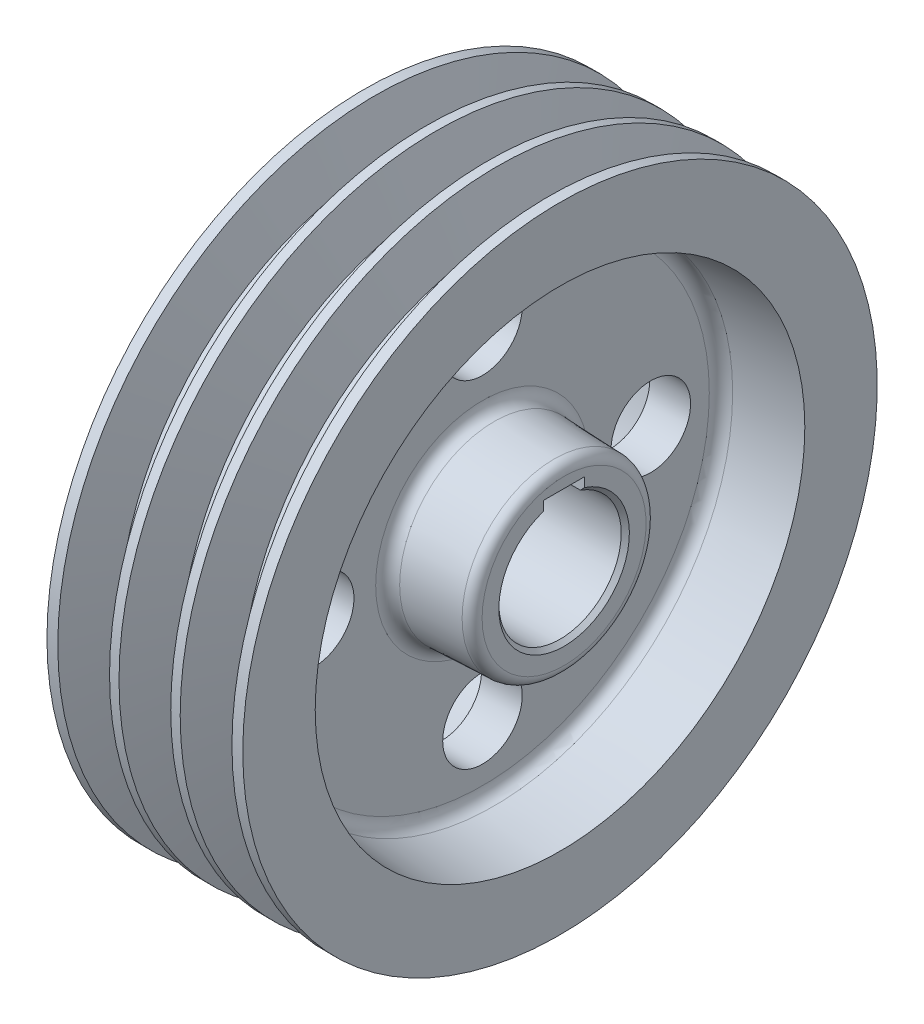
ISO-10303-21;
HEADER;
FILE_DESCRIPTION(('STEP AP214'),'2;1');
FILE_NAME('part.step','',(''),(''),'','','');
FILE_SCHEMA(('AUTOMOTIVE_DESIGN { 1 0 10303 214 1 1 1 1 }'));
ENDSEC;
DATA;
#1=APPLICATION_CONTEXT('core data for automotive mechanical design processes');
#2=APPLICATION_PROTOCOL_DEFINITION('international standard','automotive_design',2000,#1);
#3=PRODUCT_CONTEXT('',#1,'mechanical');
#4=PRODUCT('Part','Part','',(#3));
#5=PRODUCT_RELATED_PRODUCT_CATEGORY('part','',(#4));
#6=PRODUCT_DEFINITION_FORMATION('','',#4);
#7=PRODUCT_DEFINITION_CONTEXT('part definition',#1,'design');
#8=PRODUCT_DEFINITION('design','',#6,#7);
#9=PRODUCT_DEFINITION_SHAPE('','',#8);
#10=(LENGTH_UNIT() NAMED_UNIT(*) SI_UNIT(.MILLI.,.METRE.));
#11=(NAMED_UNIT(*) PLANE_ANGLE_UNIT() SI_UNIT($,.RADIAN.));
#12=(NAMED_UNIT(*) SI_UNIT($,.STERADIAN.) SOLID_ANGLE_UNIT());
#13=UNCERTAINTY_MEASURE_WITH_UNIT(LENGTH_MEASURE(1.E-05),#10,'distance_accuracy_value','');
#14=(GEOMETRIC_REPRESENTATION_CONTEXT(3) GLOBAL_UNCERTAINTY_ASSIGNED_CONTEXT((#13)) GLOBAL_UNIT_ASSIGNED_CONTEXT((#10,
#11,#12)) REPRESENTATION_CONTEXT('',''));
#15=CARTESIAN_POINT('',(0.,0.,0.));
#16=DIRECTION('',(0.,0.,1.));
#17=DIRECTION('',(1.,0.,0.));
#18=AXIS2_PLACEMENT_3D('',#15,#16,#17);
#19=CARTESIAN_POINT('',(19.,24.2497732705182,0.));
#20=DIRECTION('',(1.,0.,0.));
#21=DIRECTION('',(0.,0.,-1.));
#22=AXIS2_PLACEMENT_3D('',#19,#20,#21);
#23=PLANE('',#22);
#24=CARTESIAN_POINT('',(19.,-41.25,2.88047210454558E-13));
#25=DIRECTION('',(1.,0.,0.));
#26=DIRECTION('',(0.,0.,-1.));
#27=AXIS2_PLACEMENT_3D('',#24,#25,#26);
#28=CIRCLE('',#27,9.75000000000001);
#29=CARTESIAN_POINT('',(19.,-41.25,-9.74999999999972));
#30=VERTEX_POINT('',#29);
#31=EDGE_CURVE('E330',#30,#30,#28,.F.);
#32=ORIENTED_EDGE('',*,*,#31,.F.);
#33=EDGE_LOOP('',(#32));
#34=FACE_BOUND('',#33,.T.);
#35=CARTESIAN_POINT('',(19.,41.25,0.));
#36=DIRECTION('',(1.,0.,0.));
#37=DIRECTION('',(0.,0.,-1.));
#38=AXIS2_PLACEMENT_3D('',#35,#36,#37);
#39=CIRCLE('',#38,9.75000000000001);
#40=CARTESIAN_POINT('',(19.,41.25,-9.75000000000001));
#41=VERTEX_POINT('',#40);
#42=EDGE_CURVE('E116',#41,#41,#39,.F.);
#43=ORIENTED_EDGE('',*,*,#42,.F.);
#44=EDGE_LOOP('',(#43));
#45=FACE_BOUND('',#44,.T.);
#46=CARTESIAN_POINT('',(19.,0.,0.));
#47=DIRECTION('',(1.,0.,0.));
#48=DIRECTION('',(0.,0.,-1.));
#49=AXIS2_PLACEMENT_3D('',#46,#47,#48);
#50=CIRCLE('',#49,26.9987667925705);
#51=CARTESIAN_POINT('',(19.,0.,-26.9987667925705));
#52=VERTEX_POINT('',#51);
#53=EDGE_CURVE('E296',#52,#52,#50,.T.);
#54=ORIENTED_EDGE('',*,*,#53,.T.);
#55=EDGE_LOOP('',(#54));
#56=FACE_BOUND('',#55,.T.);
#57=CARTESIAN_POINT('',(19.,0.,0.));
#58=DIRECTION('',(1.,0.,0.));
#59=DIRECTION('',(0.,0.,-1.));
#60=AXIS2_PLACEMENT_3D('',#57,#58,#59);
#61=CIRCLE('',#60,56.357772866293);
#62=CARTESIAN_POINT('',(19.,0.,-56.357772866293));
#63=VERTEX_POINT('',#62);
#64=EDGE_CURVE('E292',#63,#63,#61,.F.);
#65=ORIENTED_EDGE('',*,*,#64,.T.);
#66=EDGE_LOOP('',(#65));
#67=FACE_BOUND('',#66,.T.);
#68=CARTESIAN_POINT('',(19.,-1.44023605227279E-13,-41.25));
#69=DIRECTION('',(1.,0.,0.));
#70=DIRECTION('',(0.,0.,-1.));
#71=AXIS2_PLACEMENT_3D('',#68,#69,#70);
#72=CIRCLE('',#71,9.75000000000001);
#73=CARTESIAN_POINT('',(19.,-1.44023605227279E-13,-51.));
#74=VERTEX_POINT('',#73);
#75=EDGE_CURVE('E327',#74,#74,#72,.F.);
#76=ORIENTED_EDGE('',*,*,#75,.F.);
#77=EDGE_LOOP('',(#76));
#78=FACE_BOUND('',#77,.T.);
#79=CARTESIAN_POINT('',(19.,4.32070815681838E-13,41.25));
#80=DIRECTION('',(1.,0.,0.));
#81=DIRECTION('',(0.,0.,-1.));
#82=AXIS2_PLACEMENT_3D('',#79,#80,#81);
#83=CIRCLE('',#82,9.75000000000001);
#84=CARTESIAN_POINT('',(19.,4.32070815681838E-13,31.5));
#85=VERTEX_POINT('',#84);
#86=EDGE_CURVE('E333',#85,#85,#83,.F.);
#87=ORIENTED_EDGE('',*,*,#86,.F.);
#88=EDGE_LOOP('',(#87));
#89=FACE_BOUND('',#88,.T.);
#90=ADVANCED_FACE('F33',(#34,#45,#56,#67,#78,#89),#23,.F.);
#91=CARTESIAN_POINT('',(29.,58.3377153930077,0.));
#92=DIRECTION('',(-1.,0.,0.));
#93=DIRECTION('',(0.,0.,1.));
#94=AXIS2_PLACEMENT_3D('',#91,#92,#93);
#95=PLANE('',#94);
#96=CARTESIAN_POINT('',(29.,-41.25,2.88047210454558E-13));
#97=DIRECTION('',(-1.,0.,0.));
#98=DIRECTION('',(0.,0.,1.));
#99=AXIS2_PLACEMENT_3D('',#96,#97,#98);
#100=CIRCLE('',#99,9.75000000000001);
#101=CARTESIAN_POINT('',(29.,-41.25,9.75000000000029));
#102=VERTEX_POINT('',#101);
#103=EDGE_CURVE('E331',#102,#102,#100,.F.);
#104=ORIENTED_EDGE('',*,*,#103,.F.);
#105=EDGE_LOOP('',(#104));
#106=FACE_BOUND('',#105,.T.);
#107=CARTESIAN_POINT('',(29.,41.25,0.));
#108=DIRECTION('',(-1.,0.,0.));
#109=DIRECTION('',(0.,0.,1.));
#110=AXIS2_PLACEMENT_3D('',#107,#108,#109);
#111=CIRCLE('',#110,9.75000000000001);
#112=CARTESIAN_POINT('',(29.,41.25,9.75000000000001));
#113=VERTEX_POINT('',#112);
#114=EDGE_CURVE('E324',#113,#113,#111,.F.);
#115=ORIENTED_EDGE('',*,*,#114,.F.);
#116=EDGE_LOOP('',(#115));
#117=FACE_BOUND('',#116,.T.);
#118=CARTESIAN_POINT('',(29.,0.,0.));
#119=DIRECTION('',(-1.,0.,0.));
#120=DIRECTION('',(0.,0.,1.));
#121=AXIS2_PLACEMENT_3D('',#118,#119,#120);
#122=CIRCLE('',#121,26.1822164694233);
#123=CARTESIAN_POINT('',(29.,0.,26.1822164694233));
#124=VERTEX_POINT('',#123);
#125=EDGE_CURVE('E307',#124,#124,#122,.T.);
#126=ORIENTED_EDGE('',*,*,#125,.T.);
#127=EDGE_LOOP('',(#126));
#128=FACE_BOUND('',#127,.T.);
#129=CARTESIAN_POINT('',(29.,0.,0.));
#130=DIRECTION('',(-1.,0.,0.));
#131=DIRECTION('',(0.,0.,1.));
#132=AXIS2_PLACEMENT_3D('',#129,#130,#131);
#133=CIRCLE('',#132,55.5887218709554);
#134=CARTESIAN_POINT('',(29.,0.,55.5887218709554));
#135=VERTEX_POINT('',#134);
#136=EDGE_CURVE('E304',#135,#135,#133,.F.);
#137=ORIENTED_EDGE('',*,*,#136,.T.);
#138=EDGE_LOOP('',(#137));
#139=FACE_BOUND('',#138,.T.);
#140=CARTESIAN_POINT('',(29.,-1.44023605227279E-13,-41.25));
#141=DIRECTION('',(-1.,0.,0.));
#142=DIRECTION('',(0.,0.,1.));
#143=AXIS2_PLACEMENT_3D('',#140,#141,#142);
#144=CIRCLE('',#143,9.75000000000001);
#145=CARTESIAN_POINT('',(29.,-1.44023605227279E-13,-31.5));
#146=VERTEX_POINT('',#145);
#147=EDGE_CURVE('E328',#146,#146,#144,.F.);
#148=ORIENTED_EDGE('',*,*,#147,.F.);
#149=EDGE_LOOP('',(#148));
#150=FACE_BOUND('',#149,.T.);
#151=CARTESIAN_POINT('',(29.,4.32070815681838E-13,41.25));
#152=DIRECTION('',(-1.,0.,0.));
#153=DIRECTION('',(0.,0.,1.));
#154=AXIS2_PLACEMENT_3D('',#151,#152,#153);
#155=CIRCLE('',#154,9.75000000000001);
#156=CARTESIAN_POINT('',(29.,4.32070815681838E-13,51.));
#157=VERTEX_POINT('',#156);
#158=EDGE_CURVE('E37',#157,#157,#155,.F.);
#159=ORIENTED_EDGE('',*,*,#158,.F.);
#160=EDGE_LOOP('',(#159));
#161=FACE_BOUND('',#160,.T.);
#162=ADVANCED_FACE('F193',(#106,#117,#128,#139,#150,#161),#95,.F.);
#163=CARTESIAN_POINT('',(0.,0.,0.));
#164=DIRECTION('',(-1.,0.,0.));
#165=DIRECTION('',(0.,0.,1.));
#166=AXIS2_PLACEMENT_3D('',#163,#164,#165);
#167=CYLINDRICAL_SURFACE('',#166,77.75);
#168=CARTESIAN_POINT('',(48.,0.,0.));
#169=DIRECTION('',(-1.,0.,0.));
#170=DIRECTION('',(0.,0.,1.));
#171=AXIS2_PLACEMENT_3D('',#168,#169,#170);
#172=CIRCLE('',#171,77.75);
#173=CARTESIAN_POINT('',(48.,0.,77.75));
#174=VERTEX_POINT('',#173);
#175=EDGE_CURVE('E245',#174,#174,#172,.T.);
#176=ORIENTED_EDGE('',*,*,#175,.T.);
#177=EDGE_LOOP('',(#176));
#178=FACE_BOUND('',#177,.T.);
#179=CARTESIAN_POINT('',(45.3407593740113,0.,0.));
#180=DIRECTION('',(-1.,0.,0.));
#181=DIRECTION('',(0.,0.,1.));
#182=AXIS2_PLACEMENT_3D('',#179,#180,#181);
#183=CIRCLE('',#182,77.75);
#184=CARTESIAN_POINT('',(45.3407593740113,0.,77.75));
#185=VERTEX_POINT('',#184);
#186=EDGE_CURVE('E278',#185,#185,#183,.T.);
#187=ORIENTED_EDGE('',*,*,#186,.F.);
#188=EDGE_LOOP('',(#187));
#189=FACE_BOUND('',#188,.T.);
#190=ADVANCED_FACE('F199',(#178,#189),#167,.T.);
#191=CARTESIAN_POINT('',(30.3407593740113,0.,0.));
#192=DIRECTION('',(-1.,0.,0.));
#193=DIRECTION('',(0.,0.,1.));
#194=AXIS2_PLACEMENT_3D('',#191,#192,#193);
#195=CIRCLE('',#194,77.75);
#196=CARTESIAN_POINT('',(30.3407593740113,0.,77.75));
#197=VERTEX_POINT('',#196);
#198=EDGE_CURVE('E266',#197,#197,#195,.T.);
#199=ORIENTED_EDGE('',*,*,#198,.F.);
#200=EDGE_LOOP('',(#199));
#201=FACE_BOUND('',#200,.T.);
#202=CARTESIAN_POINT('',(32.6592406259887,0.,0.));
#203=DIRECTION('',(-1.,0.,0.));
#204=DIRECTION('',(0.,0.,1.));
#205=AXIS2_PLACEMENT_3D('',#202,#203,#204);
#206=CIRCLE('',#205,77.75);
#207=CARTESIAN_POINT('',(32.6592406259887,0.,77.75));
#208=VERTEX_POINT('',#207);
#209=EDGE_CURVE('E281',#208,#208,#206,.T.);
#210=ORIENTED_EDGE('',*,*,#209,.T.);
#211=EDGE_LOOP('',(#210));
#212=FACE_BOUND('',#211,.T.);
#213=ADVANCED_FACE('F606',(#201,#212),#167,.T.);
#214=CARTESIAN_POINT('',(15.3407593740113,0.,0.));
#215=DIRECTION('',(-1.,0.,0.));
#216=DIRECTION('',(0.,0.,1.));
#217=AXIS2_PLACEMENT_3D('',#214,#215,#216);
#218=CIRCLE('',#217,77.75);
#219=CARTESIAN_POINT('',(15.3407593740113,0.,77.75));
#220=VERTEX_POINT('',#219);
#221=EDGE_CURVE('E254',#220,#220,#218,.T.);
#222=ORIENTED_EDGE('',*,*,#221,.F.);
#223=EDGE_LOOP('',(#222));
#224=FACE_BOUND('',#223,.T.);
#225=CARTESIAN_POINT('',(17.6592406259887,0.,0.));
#226=DIRECTION('',(-1.,0.,0.));
#227=DIRECTION('',(0.,0.,1.));
#228=AXIS2_PLACEMENT_3D('',#225,#226,#227);
#229=CIRCLE('',#228,77.75);
#230=CARTESIAN_POINT('',(17.6592406259887,0.,77.75));
#231=VERTEX_POINT('',#230);
#232=EDGE_CURVE('E269',#231,#231,#229,.T.);
#233=ORIENTED_EDGE('',*,*,#232,.T.);
#234=EDGE_LOOP('',(#233));
#235=FACE_BOUND('',#234,.T.);
#236=ADVANCED_FACE('F222',(#224,#235),#167,.T.);
#237=CARTESIAN_POINT('',(0.,0.,0.));
#238=DIRECTION('',(-1.,0.,0.));
#239=DIRECTION('',(0.,0.,1.));
#240=AXIS2_PLACEMENT_3D('',#237,#238,#239);
#241=CIRCLE('',#240,77.75);
#242=CARTESIAN_POINT('',(0.,0.,77.75));
#243=VERTEX_POINT('',#242);
#244=EDGE_CURVE('E242',#243,#243,#241,.T.);
#245=ORIENTED_EDGE('',*,*,#244,.F.);
#246=EDGE_LOOP('',(#245));
#247=FACE_BOUND('',#246,.T.);
#248=CARTESIAN_POINT('',(2.65924062598869,0.,0.));
#249=DIRECTION('',(-1.,0.,0.));
#250=DIRECTION('',(0.,0.,1.));
#251=AXIS2_PLACEMENT_3D('',#248,#249,#250);
#252=CIRCLE('',#251,77.75);
#253=CARTESIAN_POINT('',(2.65924062598869,0.,77.75));
#254=VERTEX_POINT('',#253);
#255=EDGE_CURVE('E257',#254,#254,#252,.T.);
#256=ORIENTED_EDGE('',*,*,#255,.T.);
#257=EDGE_LOOP('',(#256));
#258=FACE_BOUND('',#257,.T.);
#259=ADVANCED_FACE('F217',(#247,#258),#167,.T.);
#260=CARTESIAN_POINT('',(0.,0.,0.));
#261=DIRECTION('',(-1.,0.,0.));
#262=DIRECTION('',(0.,0.,1.));
#263=AXIS2_PLACEMENT_3D('',#260,#261,#262);
#264=CYLINDRICAL_SURFACE('',#263,15.);
#265=CARTESIAN_POINT('',(0.,0.,0.));
#266=DIRECTION('',(1.,0.,0.));
#267=DIRECTION('',(0.,0.,-1.));
#268=AXIS2_PLACEMENT_3D('',#265,#266,#267);
#269=CIRCLE('',#268,15.);
#270=CARTESIAN_POINT('',(0.,14.1421356237309,-5.));
#271=VERTEX_POINT('',#270);
#272=CARTESIAN_POINT('',(0.,14.1421356237309,5.));
#273=VERTEX_POINT('',#272);
#274=EDGE_CURVE('E228',#271,#273,#269,.F.);
#275=ORIENTED_EDGE('',*,*,#274,.T.);
#276=DIRECTION('',(-1.,0.,0.));
#277=VECTOR('',#276,1.);
#278=CARTESIAN_POINT('',(49.,14.1421356237309,5.));
#279=LINE('',#278,#277);
#280=CARTESIAN_POINT('',(48.,14.1421356237309,5.));
#281=VERTEX_POINT('',#280);
#282=EDGE_CURVE('E95',#281,#273,#279,.T.);
#283=ORIENTED_EDGE('',*,*,#282,.F.);
#284=CARTESIAN_POINT('',(48.,0.,0.));
#285=DIRECTION('',(-1.,0.,0.));
#286=DIRECTION('',(0.,0.,1.));
#287=AXIS2_PLACEMENT_3D('',#284,#285,#286);
#288=CIRCLE('',#287,15.);
#289=CARTESIAN_POINT('',(48.,14.1421356237309,-5.));
#290=VERTEX_POINT('',#289);
#291=EDGE_CURVE('E234',#281,#290,#288,.F.);
#292=ORIENTED_EDGE('',*,*,#291,.T.);
#293=DIRECTION('',(-1.,0.,0.));
#294=VECTOR('',#293,1.);
#295=CARTESIAN_POINT('',(49.,14.1421356237309,-5.));
#296=LINE('',#295,#294);
#297=EDGE_CURVE('E103',#290,#271,#296,.T.);
#298=ORIENTED_EDGE('',*,*,#297,.T.);
#299=EDGE_LOOP('',(#275,#283,#292,#298));
#300=FACE_BOUND('',#299,.T.);
#301=ADVANCED_FACE('F214',(#300),#264,.F.);
#302=CARTESIAN_POINT('',(-1.,15.,0.));
#303=DIRECTION('',(1.,0.,0.));
#304=DIRECTION('',(0.,0.,-1.));
#305=AXIS2_PLACEMENT_3D('',#302,#303,#304);
#306=PLANE('',#305);
#307=CARTESIAN_POINT('',(-1.,0.,0.));
#308=DIRECTION('',(1.,0.,0.));
#309=DIRECTION('',(0.,0.,-1.));
#310=AXIS2_PLACEMENT_3D('',#307,#308,#309);
#311=CIRCLE('',#310,20.2091720649564);
#312=CARTESIAN_POINT('',(-1.,0.,-20.2091720649564));
#313=VERTEX_POINT('',#312);
#314=EDGE_CURVE('E42',#313,#313,#311,.F.);
#315=ORIENTED_EDGE('',*,*,#314,.T.);
#316=EDGE_LOOP('',(#315));
#317=FACE_BOUND('',#316,.T.);
#318=CARTESIAN_POINT('',(-1.,0.,0.));
#319=DIRECTION('',(1.,0.,0.));
#320=DIRECTION('',(0.,0.,-1.));
#321=AXIS2_PLACEMENT_3D('',#318,#319,#320);
#322=CIRCLE('',#321,16.);
#323=CARTESIAN_POINT('',(-1.,15.1986841535706,5.));
#324=VERTEX_POINT('',#323);
#325=CARTESIAN_POINT('',(-1.,15.1986841535706,-5.));
#326=VERTEX_POINT('',#325);
#327=EDGE_CURVE('E233',#324,#326,#322,.T.);
#328=ORIENTED_EDGE('',*,*,#327,.T.);
#329=DIRECTION('',(0.,-1.,0.));
#330=VECTOR('',#329,1.);
#331=CARTESIAN_POINT('',(-1.,14.1421356237309,-5.));
#332=LINE('',#331,#330);
#333=CARTESIAN_POINT('',(-1.,17.5,-5.));
#334=VERTEX_POINT('',#333);
#335=EDGE_CURVE('E58',#334,#326,#332,.T.);
#336=ORIENTED_EDGE('',*,*,#335,.F.);
#337=DIRECTION('',(0.,0.,-1.));
#338=VECTOR('',#337,1.);
#339=CARTESIAN_POINT('',(-1.,17.5,-5.));
#340=LINE('',#339,#338);
#341=CARTESIAN_POINT('',(-1.,17.5,5.));
#342=VERTEX_POINT('',#341);
#343=EDGE_CURVE('E111',#342,#334,#340,.T.);
#344=ORIENTED_EDGE('',*,*,#343,.F.);
#345=DIRECTION('',(0.,1.,0.));
#346=VECTOR('',#345,1.);
#347=CARTESIAN_POINT('',(-1.,14.1421356237309,5.));
#348=LINE('',#347,#346);
#349=EDGE_CURVE('E90',#324,#342,#348,.T.);
#350=ORIENTED_EDGE('',*,*,#349,.F.);
#351=EDGE_LOOP('',(#328,#336,#344,#350));
#352=FACE_BOUND('',#351,.T.);
#353=ADVANCED_FACE('F211',(#317,#352),#306,.F.);
#354=CARTESIAN_POINT('',(19.,0.,0.));
#355=DIRECTION('',(1.,0.,0.));
#356=DIRECTION('',(0.,0.,-1.));
#357=AXIS2_PLACEMENT_3D('',#354,#355,#356);
#358=CONICAL_SURFACE('',#357,24.2497732705182,0.0872664625997025);
#359=CARTESIAN_POINT('',(1.28211064313088,0.,0.));
#360=DIRECTION('',(-1.,0.,0.));
#361=DIRECTION('',(0.,0.,1.));
#362=AXIS2_PLACEMENT_3D('',#359,#360,#361);
#363=CIRCLE('',#362,22.6996588101858);
#364=CARTESIAN_POINT('',(1.28211064313088,0.,22.6996588101858));
#365=VERTEX_POINT('',#364);
#366=EDGE_CURVE('E11',#365,#365,#363,.F.);
#367=ORIENTED_EDGE('',*,*,#366,.T.);
#368=EDGE_LOOP('',(#367));
#369=FACE_BOUND('',#368,.T.);
#370=CARTESIAN_POINT('',(16.2614672282429,0.,0.));
#371=DIRECTION('',(1.,0.,0.));
#372=DIRECTION('',(0.,0.,-1.));
#373=AXIS2_PLACEMENT_3D('',#370,#371,#372);
#374=CIRCLE('',#373,24.0101826982953);
#375=CARTESIAN_POINT('',(16.2614672282429,0.,-24.0101826982953));
#376=VERTEX_POINT('',#375);
#377=EDGE_CURVE('E290',#376,#376,#374,.F.);
#378=ORIENTED_EDGE('',*,*,#377,.T.);
#379=EDGE_LOOP('',(#378));
#380=FACE_BOUND('',#379,.T.);
#381=ADVANCED_FACE('F208',(#369,#380),#358,.T.);
#382=CARTESIAN_POINT('',(0.,0.,0.));
#383=DIRECTION('',(-1.,0.,0.));
#384=DIRECTION('',(0.,0.,1.));
#385=AXIS2_PLACEMENT_3D('',#382,#383,#384);
#386=CONICAL_SURFACE('',#385,60.,0.0399680398706699);
#387=CARTESIAN_POINT('',(16.1198721988047,0.,0.));
#388=DIRECTION('',(-1.,0.,0.));
#389=DIRECTION('',(0.,0.,1.));
#390=AXIS2_PLACEMENT_3D('',#387,#388,#389);
#391=CIRCLE('',#390,59.3553770189379);
#392=CARTESIAN_POINT('',(16.1198721988047,0.,59.3553770189379));
#393=VERTEX_POINT('',#392);
#394=EDGE_CURVE('E301',#393,#393,#391,.F.);
#395=ORIENTED_EDGE('',*,*,#394,.T.);
#396=EDGE_LOOP('',(#395));
#397=FACE_BOUND('',#396,.T.);
#398=CARTESIAN_POINT('',(0.,0.,0.));
#399=DIRECTION('',(-1.,0.,0.));
#400=DIRECTION('',(0.,0.,1.));
#401=AXIS2_PLACEMENT_3D('',#398,#399,#400);
#402=CIRCLE('',#401,60.);
#403=CARTESIAN_POINT('',(0.,0.,60.));
#404=VERTEX_POINT('',#403);
#405=EDGE_CURVE('E237',#404,#404,#402,.T.);
#406=ORIENTED_EDGE('',*,*,#405,.T.);
#407=EDGE_LOOP('',(#406));
#408=FACE_BOUND('',#407,.T.);
#409=ADVANCED_FACE('F206',(#397,#408),#386,.F.);
#410=CARTESIAN_POINT('',(0.,60.,0.));
#411=DIRECTION('',(1.,0.,0.));
#412=DIRECTION('',(0.,0.,-1.));
#413=AXIS2_PLACEMENT_3D('',#410,#411,#412);
#414=PLANE('',#413);
#415=ORIENTED_EDGE('',*,*,#405,.F.);
#416=EDGE_LOOP('',(#415));
#417=FACE_BOUND('',#416,.T.);
#418=ORIENTED_EDGE('',*,*,#244,.T.);
#419=EDGE_LOOP('',(#418));
#420=FACE_BOUND('',#419,.T.);
#421=ADVANCED_FACE('F495',(#417,#420),#414,.F.);
#422=CARTESIAN_POINT('',(48.,77.75,0.));
#423=DIRECTION('',(-1.,0.,0.));
#424=DIRECTION('',(0.,0.,1.));
#425=AXIS2_PLACEMENT_3D('',#422,#423,#424);
#426=PLANE('',#425);
#427=ORIENTED_EDGE('',*,*,#175,.F.);
#428=EDGE_LOOP('',(#427));
#429=FACE_BOUND('',#428,.T.);
#430=CARTESIAN_POINT('',(48.,0.,0.));
#431=DIRECTION('',(-1.,0.,0.));
#432=DIRECTION('',(0.,0.,1.));
#433=AXIS2_PLACEMENT_3D('',#430,#431,#432);
#434=CIRCLE('',#433,60.);
#435=CARTESIAN_POINT('',(48.,0.,60.));
#436=VERTEX_POINT('',#435);
#437=EDGE_CURVE('E248',#436,#436,#434,.T.);
#438=ORIENTED_EDGE('',*,*,#437,.T.);
#439=EDGE_LOOP('',(#438));
#440=FACE_BOUND('',#439,.T.);
#441=ADVANCED_FACE('F485',(#429,#440),#426,.F.);
#442=CARTESIAN_POINT('',(29.,0.,0.));
#443=DIRECTION('',(1.,0.,0.));
#444=DIRECTION('',(0.,0.,-1.));
#445=AXIS2_PLACEMENT_3D('',#442,#443,#444);
#446=CONICAL_SURFACE('',#445,58.3377153930077,0.0872664625997022);
#447=CARTESIAN_POINT('',(31.7385327717571,0.,0.));
#448=DIRECTION('',(1.,0.,0.));
#449=DIRECTION('',(0.,0.,-1.));
#450=AXIS2_PLACEMENT_3D('',#447,#448,#449);
#451=CIRCLE('',#450,58.5773059652306);
#452=CARTESIAN_POINT('',(31.7385327717571,0.,-58.5773059652306));
#453=VERTEX_POINT('',#452);
#454=EDGE_CURVE('E313',#453,#453,#451,.F.);
#455=ORIENTED_EDGE('',*,*,#454,.T.);
#456=EDGE_LOOP('',(#455));
#457=FACE_BOUND('',#456,.T.);
#458=ORIENTED_EDGE('',*,*,#437,.F.);
#459=EDGE_LOOP('',(#458));
#460=FACE_BOUND('',#459,.T.);
#461=ADVANCED_FACE('F436',(#457,#460),#446,.F.);
#462=CARTESIAN_POINT('',(49.,0.,0.));
#463=DIRECTION('',(-1.,0.,0.));
#464=DIRECTION('',(0.,0.,1.));
#465=AXIS2_PLACEMENT_3D('',#462,#463,#464);
#466=CONICAL_SURFACE('',#465,22.5,0.0399680398706701);
#467=CARTESIAN_POINT('',(46.599893499004,0.,0.));
#468=DIRECTION('',(1.,0.,0.));
#469=DIRECTION('',(0.,0.,-1.));
#470=AXIS2_PLACEMENT_3D('',#467,#468,#469);
#471=CIRCLE('',#470,22.5959786646232);
#472=CARTESIAN_POINT('',(46.599893499004,0.,-22.5959786646232));
#473=VERTEX_POINT('',#472);
#474=EDGE_CURVE('E316',#473,#473,#471,.F.);
#475=ORIENTED_EDGE('',*,*,#474,.T.);
#476=EDGE_LOOP('',(#475));
#477=FACE_BOUND('',#476,.T.);
#478=CARTESIAN_POINT('',(31.8801278011953,0.,0.));
#479=DIRECTION('',(-1.,0.,0.));
#480=DIRECTION('',(0.,0.,1.));
#481=AXIS2_PLACEMENT_3D('',#478,#479,#480);
#482=CIRCLE('',#481,23.1846123167785);
#483=CARTESIAN_POINT('',(31.8801278011953,0.,23.1846123167785));
#484=VERTEX_POINT('',#483);
#485=EDGE_CURVE('E310',#484,#484,#482,.F.);
#486=ORIENTED_EDGE('',*,*,#485,.T.);
#487=EDGE_LOOP('',(#486));
#488=FACE_BOUND('',#487,.T.);
#489=ADVANCED_FACE('F424',(#477,#488),#466,.T.);
#490=CARTESIAN_POINT('',(49.,22.5,0.));
#491=DIRECTION('',(-1.,0.,0.));
#492=DIRECTION('',(0.,0.,1.));
#493=AXIS2_PLACEMENT_3D('',#490,#491,#492);
#494=PLANE('',#493);
#495=CARTESIAN_POINT('',(49.,0.,0.));
#496=DIRECTION('',(-1.,0.,0.));
#497=DIRECTION('',(0.,0.,1.));
#498=AXIS2_PLACEMENT_3D('',#495,#496,#497);
#499=CIRCLE('',#498,20.0979752040859);
#500=CARTESIAN_POINT('',(49.,0.,20.0979752040859));
#501=VERTEX_POINT('',#500);
#502=EDGE_CURVE('E319',#501,#501,#499,.F.);
#503=ORIENTED_EDGE('',*,*,#502,.T.);
#504=EDGE_LOOP('',(#503));
#505=FACE_BOUND('',#504,.T.);
#506=DIRECTION('',(0.,0.,-1.));
#507=VECTOR('',#506,1.);
#508=CARTESIAN_POINT('',(49.,17.5,-5.));
#509=LINE('',#508,#507);
#510=CARTESIAN_POINT('',(49.,17.5,5.));
#511=VERTEX_POINT('',#510);
#512=CARTESIAN_POINT('',(49.,17.5,-5.));
#513=VERTEX_POINT('',#512);
#514=EDGE_CURVE('E98',#511,#513,#509,.T.);
#515=ORIENTED_EDGE('',*,*,#514,.T.);
#516=DIRECTION('',(0.,-1.,0.));
#517=VECTOR('',#516,1.);
#518=CARTESIAN_POINT('',(49.,14.1421356237309,-5.));
#519=LINE('',#518,#517);
#520=CARTESIAN_POINT('',(49.,15.1986841535706,-5.));
#521=VERTEX_POINT('',#520);
#522=EDGE_CURVE('E109',#513,#521,#519,.T.);
#523=ORIENTED_EDGE('',*,*,#522,.T.);
#524=CARTESIAN_POINT('',(49.,0.,0.));
#525=DIRECTION('',(-1.,0.,0.));
#526=DIRECTION('',(0.,0.,1.));
#527=AXIS2_PLACEMENT_3D('',#524,#525,#526);
#528=CIRCLE('',#527,16.);
#529=CARTESIAN_POINT('',(49.,15.1986841535706,5.));
#530=VERTEX_POINT('',#529);
#531=EDGE_CURVE('E108',#521,#530,#528,.T.);
#532=ORIENTED_EDGE('',*,*,#531,.T.);
#533=DIRECTION('',(0.,1.,0.));
#534=VECTOR('',#533,1.);
#535=CARTESIAN_POINT('',(49.,14.1421356237309,5.));
#536=LINE('',#535,#534);
#537=EDGE_CURVE('E50',#530,#511,#536,.T.);
#538=ORIENTED_EDGE('',*,*,#537,.T.);
#539=EDGE_LOOP('',(#515,#523,#532,#538));
#540=FACE_BOUND('',#539,.T.);
#541=ADVANCED_FACE('F106',(#505,#540),#494,.F.);
#542=CARTESIAN_POINT('',(0.,0.,0.));
#543=DIRECTION('',(-1.,0.,0.));
#544=DIRECTION('',(0.,0.,1.));
#545=AXIS2_PLACEMENT_3D('',#542,#543,#544);
#546=CYLINDRICAL_SURFACE('',#545,66.3);
#547=CARTESIAN_POINT('',(11.8401430713097,0.,0.));
#548=DIRECTION('',(-1.,0.,0.));
#549=DIRECTION('',(0.,0.,1.));
#550=AXIS2_PLACEMENT_3D('',#547,#548,#549);
#551=CIRCLE('',#550,66.3);
#552=CARTESIAN_POINT('',(11.8401430713097,0.,66.3));
#553=VERTEX_POINT('',#552);
#554=EDGE_CURVE('E251',#553,#553,#551,.T.);
#555=ORIENTED_EDGE('',*,*,#554,.T.);
#556=EDGE_LOOP('',(#555));
#557=FACE_BOUND('',#556,.T.);
#558=CARTESIAN_POINT('',(6.15985692869032,0.,0.));
#559=DIRECTION('',(-1.,0.,0.));
#560=DIRECTION('',(0.,0.,1.));
#561=AXIS2_PLACEMENT_3D('',#558,#559,#560);
#562=CIRCLE('',#561,66.3);
#563=CARTESIAN_POINT('',(6.15985692869032,0.,66.3));
#564=VERTEX_POINT('',#563);
#565=EDGE_CURVE('E260',#564,#564,#562,.T.);
#566=ORIENTED_EDGE('',*,*,#565,.F.);
#567=EDGE_LOOP('',(#566));
#568=FACE_BOUND('',#567,.T.);
#569=ADVANCED_FACE('F423',(#557,#568),#546,.T.);
#570=CARTESIAN_POINT('',(11.8401430713097,0.,0.));
#571=DIRECTION('',(1.,0.,0.));
#572=DIRECTION('',(0.,0.,-1.));
#573=AXIS2_PLACEMENT_3D('',#570,#571,#572);
#574=CONICAL_SURFACE('',#573,66.3,1.27409035395586);
#575=ORIENTED_EDGE('',*,*,#221,.T.);
#576=EDGE_LOOP('',(#575));
#577=FACE_BOUND('',#576,.T.);
#578=ORIENTED_EDGE('',*,*,#554,.F.);
#579=EDGE_LOOP('',(#578));
#580=FACE_BOUND('',#579,.T.);
#581=ADVANCED_FACE('F629',(#577,#580),#574,.T.);
#582=CARTESIAN_POINT('',(2.65924062598869,0.,0.));
#583=DIRECTION('',(-1.,0.,0.));
#584=DIRECTION('',(0.,0.,1.));
#585=AXIS2_PLACEMENT_3D('',#582,#583,#584);
#586=CONICAL_SURFACE('',#585,77.75,1.27409035395586);
#587=ORIENTED_EDGE('',*,*,#565,.T.);
#588=EDGE_LOOP('',(#587));
#589=FACE_BOUND('',#588,.T.);
#590=ORIENTED_EDGE('',*,*,#255,.F.);
#591=EDGE_LOOP('',(#590));
#592=FACE_BOUND('',#591,.T.);
#593=ADVANCED_FACE('F595',(#589,#592),#586,.T.);
#594=CARTESIAN_POINT('',(15.,0.,0.));
#595=DIRECTION('',(-1.,0.,0.));
#596=DIRECTION('',(0.,0.,1.));
#597=AXIS2_PLACEMENT_3D('',#594,#595,#596);
#598=CYLINDRICAL_SURFACE('',#597,66.3);
#599=CARTESIAN_POINT('',(26.8401430713097,0.,0.));
#600=DIRECTION('',(-1.,0.,0.));
#601=DIRECTION('',(0.,0.,1.));
#602=AXIS2_PLACEMENT_3D('',#599,#600,#601);
#603=CIRCLE('',#602,66.3);
#604=CARTESIAN_POINT('',(26.8401430713097,0.,66.3));
#605=VERTEX_POINT('',#604);
#606=EDGE_CURVE('E263',#605,#605,#603,.T.);
#607=ORIENTED_EDGE('',*,*,#606,.T.);
#608=EDGE_LOOP('',(#607));
#609=FACE_BOUND('',#608,.T.);
#610=CARTESIAN_POINT('',(21.1598569286903,0.,0.));
#611=DIRECTION('',(-1.,0.,0.));
#612=DIRECTION('',(0.,0.,1.));
#613=AXIS2_PLACEMENT_3D('',#610,#611,#612);
#614=CIRCLE('',#613,66.3);
#615=CARTESIAN_POINT('',(21.1598569286903,0.,66.3));
#616=VERTEX_POINT('',#615);
#617=EDGE_CURVE('E272',#616,#616,#614,.T.);
#618=ORIENTED_EDGE('',*,*,#617,.F.);
#619=EDGE_LOOP('',(#618));
#620=FACE_BOUND('',#619,.T.);
#621=ADVANCED_FACE('F585',(#609,#620),#598,.T.);
#622=CARTESIAN_POINT('',(26.8401430713097,0.,0.));
#623=DIRECTION('',(1.,0.,0.));
#624=DIRECTION('',(0.,0.,-1.));
#625=AXIS2_PLACEMENT_3D('',#622,#623,#624);
#626=CONICAL_SURFACE('',#625,66.3,1.27409035395586);
#627=ORIENTED_EDGE('',*,*,#198,.T.);
#628=EDGE_LOOP('',(#627));
#629=FACE_BOUND('',#628,.T.);
#630=ORIENTED_EDGE('',*,*,#606,.F.);
#631=EDGE_LOOP('',(#630));
#632=FACE_BOUND('',#631,.T.);
#633=ADVANCED_FACE('F574',(#629,#632),#626,.T.);
#634=CARTESIAN_POINT('',(17.6592406259887,0.,0.));
#635=DIRECTION('',(-1.,0.,0.));
#636=DIRECTION('',(0.,0.,1.));
#637=AXIS2_PLACEMENT_3D('',#634,#635,#636);
#638=CONICAL_SURFACE('',#637,77.75,1.27409035395586);
#639=ORIENTED_EDGE('',*,*,#617,.T.);
#640=EDGE_LOOP('',(#639));
#641=FACE_BOUND('',#640,.T.);
#642=ORIENTED_EDGE('',*,*,#232,.F.);
#643=EDGE_LOOP('',(#642));
#644=FACE_BOUND('',#643,.T.);
#645=ADVANCED_FACE('F562',(#641,#644),#638,.T.);
#646=CARTESIAN_POINT('',(30.,0.,0.));
#647=DIRECTION('',(-1.,0.,0.));
#648=DIRECTION('',(0.,0.,1.));
#649=AXIS2_PLACEMENT_3D('',#646,#647,#648);
#650=CYLINDRICAL_SURFACE('',#649,66.3);
#651=CARTESIAN_POINT('',(41.8401430713097,0.,0.));
#652=DIRECTION('',(-1.,0.,0.));
#653=DIRECTION('',(0.,0.,1.));
#654=AXIS2_PLACEMENT_3D('',#651,#652,#653);
#655=CIRCLE('',#654,66.3);
#656=CARTESIAN_POINT('',(41.8401430713097,0.,66.3));
#657=VERTEX_POINT('',#656);
#658=EDGE_CURVE('E275',#657,#657,#655,.T.);
#659=ORIENTED_EDGE('',*,*,#658,.T.);
#660=EDGE_LOOP('',(#659));
#661=FACE_BOUND('',#660,.T.);
#662=CARTESIAN_POINT('',(36.1598569286903,0.,0.));
#663=DIRECTION('',(-1.,0.,0.));
#664=DIRECTION('',(0.,0.,1.));
#665=AXIS2_PLACEMENT_3D('',#662,#663,#664);
#666=CIRCLE('',#665,66.3);
#667=CARTESIAN_POINT('',(36.1598569286903,0.,66.3));
#668=VERTEX_POINT('',#667);
#669=EDGE_CURVE('E283',#668,#668,#666,.T.);
#670=ORIENTED_EDGE('',*,*,#669,.F.);
#671=EDGE_LOOP('',(#670));
#672=FACE_BOUND('',#671,.T.);
#673=ADVANCED_FACE('F551',(#661,#672),#650,.T.);
#674=CARTESIAN_POINT('',(41.8401430713097,0.,0.));
#675=DIRECTION('',(1.,0.,0.));
#676=DIRECTION('',(0.,0.,-1.));
#677=AXIS2_PLACEMENT_3D('',#674,#675,#676);
#678=CONICAL_SURFACE('',#677,66.3,1.27409035395586);
#679=ORIENTED_EDGE('',*,*,#186,.T.);
#680=EDGE_LOOP('',(#679));
#681=FACE_BOUND('',#680,.T.);
#682=ORIENTED_EDGE('',*,*,#658,.F.);
#683=EDGE_LOOP('',(#682));
#684=FACE_BOUND('',#683,.T.);
#685=ADVANCED_FACE('F542',(#681,#684),#678,.T.);
#686=CARTESIAN_POINT('',(32.6592406259887,0.,0.));
#687=DIRECTION('',(-1.,0.,0.));
#688=DIRECTION('',(0.,0.,1.));
#689=AXIS2_PLACEMENT_3D('',#686,#687,#688);
#690=CONICAL_SURFACE('',#689,77.75,1.27409035395586);
#691=ORIENTED_EDGE('',*,*,#669,.T.);
#692=EDGE_LOOP('',(#691));
#693=FACE_BOUND('',#692,.T.);
#694=ORIENTED_EDGE('',*,*,#209,.F.);
#695=EDGE_LOOP('',(#694));
#696=FACE_BOUND('',#695,.T.);
#697=ADVANCED_FACE('F530',(#693,#696),#690,.T.);
#698=CARTESIAN_POINT('',(0.,0.,0.));
#699=DIRECTION('',(-1.,0.,0.));
#700=DIRECTION('',(0.,0.,1.));
#701=AXIS2_PLACEMENT_3D('',#698,#699,#700);
#702=CONICAL_SURFACE('',#701,15.,0.785398163397451);
#703=CARTESIAN_POINT('',(-3.58174559227643,17.8964038079186,-5.));
#704=CARTESIAN_POINT('',(-3.09997213000908,17.396118085788,-5.));
#705=CARTESIAN_POINT('',(-2.61889578342018,16.8951572403237,-5.));
#706=CARTESIAN_POINT('',(-1.65873232155843,15.8913611547452,-5.));
#707=CARTESIAN_POINT('',(-1.17964514945595,15.3885259689696,-5.));
#708=CARTESIAN_POINT('',(-0.224020059287621,14.3804207463801,-5.));
#709=CARTESIAN_POINT('',(0.252517820307464,13.8751506730393,-5.));
#710=CARTESIAN_POINT('',(0.964704428430916,13.1147774124467,-5.));
#711=CARTESIAN_POINT('',(1.20166665824579,12.8609046244965,-5.));
#712=CARTESIAN_POINT('',(1.67454529182143,12.3521847970237,-5.));
#713=CARTESIAN_POINT('',(1.91046169045336,12.0973377527347,-5.));
#714=CARTESIAN_POINT('',(2.14576896582212,11.8419278616288,-5.));
#715=B_SPLINE_CURVE_WITH_KNOTS('',3,(#703,#704,#705,#706,#707,#708,#709,#710,#711,#712,#713,
#714),.UNSPECIFIED.,.F.,.F.,(4,2,2,2,2,4),(0.,2.08363547236907,4.16721100105185,
6.25081788427836,7.29265135113275,8.33448992158251),.UNSPECIFIED.);
#716=EDGE_CURVE('E130',#326,#271,#715,.T.);
#717=ORIENTED_EDGE('',*,*,#716,.F.);
#718=ORIENTED_EDGE('',*,*,#327,.F.);
#719=CARTESIAN_POINT('',(2.14576896582212,11.8419278616288,5.));
#720=CARTESIAN_POINT('',(1.91046169045336,12.0973377527348,5.));
#721=CARTESIAN_POINT('',(1.67454529182143,12.3521847970237,5.));
#722=CARTESIAN_POINT('',(1.20166665824579,12.8609046244965,5.));
#723=CARTESIAN_POINT('',(0.964704428430916,13.1147774124467,5.));
#724=CARTESIAN_POINT('',(0.252517820307463,13.8751506730393,5.));
#725=CARTESIAN_POINT('',(-0.224020059287621,14.3804207463801,5.));
#726=CARTESIAN_POINT('',(-1.17964514945595,15.3885259689696,5.));
#727=CARTESIAN_POINT('',(-1.65873232155843,15.8913611547452,5.));
#728=CARTESIAN_POINT('',(-2.61889578342018,16.8951572403237,5.));
#729=CARTESIAN_POINT('',(-3.09997213000908,17.396118085788,5.));
#730=CARTESIAN_POINT('',(-3.58174559227643,17.8964038079186,5.));
#731=B_SPLINE_CURVE_WITH_KNOTS('',3,(#719,#720,#721,#722,#723,#724,#725,#726,#727,#728,#729,
#730),.UNSPECIFIED.,.F.,.F.,(4,2,2,2,2,4),(0.,1.04183857044976,2.08367203730415,
4.16727892053066,6.25085444921344,8.33448992158251),.UNSPECIFIED.);
#732=EDGE_CURVE('E119',#273,#324,#731,.T.);
#733=ORIENTED_EDGE('',*,*,#732,.F.);
#734=ORIENTED_EDGE('',*,*,#274,.F.);
#735=EDGE_LOOP('',(#717,#718,#733,#734));
#736=FACE_BOUND('',#735,.T.);
#737=ADVANCED_FACE('F136',(#736),#702,.F.);
#738=CARTESIAN_POINT('',(49.,0.,0.));
#739=DIRECTION('',(1.,0.,0.));
#740=DIRECTION('',(0.,0.,-1.));
#741=AXIS2_PLACEMENT_3D('',#738,#739,#740);
#742=CONICAL_SURFACE('',#741,16.,0.785398163397431);
#743=CARTESIAN_POINT('',(45.3935648818033,11.3402138639212,-5.));
#744=CARTESIAN_POINT('',(45.6280098334286,11.5964208388712,-5.));
#745=CARTESIAN_POINT('',(45.8631420790268,11.8519967766268,-5.));
#746=CARTESIAN_POINT('',(46.3345797049217,12.3620616743873,-5.));
#747=CARTESIAN_POINT('',(46.5708850778576,12.6165506411937,-5.));
#748=CARTESIAN_POINT('',(47.2812465274172,13.3786367142871,-5.));
#749=CARTESIAN_POINT('',(47.7567644045872,13.8848709363866,-5.));
#750=CARTESIAN_POINT('',(48.7106157992899,14.8946574907932,-5.));
#751=CARTESIAN_POINT('',(49.1889492634205,15.3982098736228,-5.));
#752=CARTESIAN_POINT('',(49.9080529348813,16.1520246950607,-5.));
#753=CARTESIAN_POINT('',(50.1480257592246,16.4030485363952,-5.));
#754=CARTESIAN_POINT('',(50.6284399746702,16.9046468047848,-5.));
#755=CARTESIAN_POINT('',(50.8688813651156,17.155221232469,-5.));
#756=CARTESIAN_POINT('',(51.1095258383036,17.4056004230874,-5.));
#757=B_SPLINE_CURVE_WITH_KNOTS('',3,(#743,#744,#745,#746,#747,#748,#749,#750,#751,#752,#753,
#754,#755,#756),.UNSPECIFIED.,.F.,.F.,(4,2,2,2,2,2,4),(0.,1.04184957076242,2.08369261262204,
4.16730563090482,6.25087925662326,7.29270375500366,8.3345267940145),.UNSPECIFIED.);
#758=EDGE_CURVE('E156',#290,#521,#757,.T.);
#759=ORIENTED_EDGE('',*,*,#758,.F.);
#760=ORIENTED_EDGE('',*,*,#291,.F.);
#761=CARTESIAN_POINT('',(51.1095258383036,17.4056004230874,5.));
#762=CARTESIAN_POINT('',(50.8688813651156,17.155221232469,5.));
#763=CARTESIAN_POINT('',(50.6284399746702,16.9046468047848,5.));
#764=CARTESIAN_POINT('',(50.1480257592246,16.4030485363952,5.));
#765=CARTESIAN_POINT('',(49.9080529348813,16.1520246950606,5.));
#766=CARTESIAN_POINT('',(49.1889492634205,15.3982098736228,5.));
#767=CARTESIAN_POINT('',(48.7106157992899,14.8946574907932,5.));
#768=CARTESIAN_POINT('',(47.7567644045872,13.8848709363866,5.));
#769=CARTESIAN_POINT('',(47.2812465274172,13.3786367142871,5.));
#770=CARTESIAN_POINT('',(46.5708850778576,12.6165506411937,5.));
#771=CARTESIAN_POINT('',(46.3345797049217,12.3620616743873,5.));
#772=CARTESIAN_POINT('',(45.8631420790268,11.8519967766268,5.));
#773=CARTESIAN_POINT('',(45.6280098334286,11.5964208388712,5.));
#774=CARTESIAN_POINT('',(45.3935648818033,11.3402138639212,5.));
#775=B_SPLINE_CURVE_WITH_KNOTS('',3,(#761,#762,#763,#764,#765,#766,#767,#768,#769,#770,#771,
#772,#773,#774),.UNSPECIFIED.,.F.,.F.,(4,2,2,2,2,2,4),(0.,1.04182303901085,2.08364753739124,
4.16722116310968,6.25083418139245,7.29267722325208,8.3345267940145),.UNSPECIFIED.);
#776=EDGE_CURVE('E150',#530,#281,#775,.T.);
#777=ORIENTED_EDGE('',*,*,#776,.F.);
#778=ORIENTED_EDGE('',*,*,#531,.F.);
#779=EDGE_LOOP('',(#759,#760,#777,#778));
#780=FACE_BOUND('',#779,.T.);
#781=ADVANCED_FACE('F162',(#780),#742,.F.);
#782=CARTESIAN_POINT('',(49.,14.1421356237309,-5.));
#783=DIRECTION('',(0.,0.,-1.));
#784=DIRECTION('',(-1.,0.,0.));
#785=AXIS2_PLACEMENT_3D('',#782,#783,#784);
#786=PLANE('',#785);
#787=ORIENTED_EDGE('',*,*,#716,.T.);
#788=ORIENTED_EDGE('',*,*,#297,.F.);
#789=ORIENTED_EDGE('',*,*,#758,.T.);
#790=ORIENTED_EDGE('',*,*,#522,.F.);
#791=DIRECTION('',(-1.,0.,0.));
#792=VECTOR('',#791,1.);
#793=CARTESIAN_POINT('',(49.,17.5,-5.));
#794=LINE('',#793,#792);
#795=EDGE_CURVE('E94',#513,#334,#794,.T.);
#796=ORIENTED_EDGE('',*,*,#795,.T.);
#797=ORIENTED_EDGE('',*,*,#335,.T.);
#798=EDGE_LOOP('',(#787,#788,#789,#790,#796,#797));
#799=FACE_BOUND('',#798,.T.);
#800=ADVANCED_FACE('F145',(#799),#786,.F.);
#801=CARTESIAN_POINT('',(49.,17.5,-5.));
#802=DIRECTION('',(0.,1.,0.));
#803=DIRECTION('',(0.,0.,1.));
#804=AXIS2_PLACEMENT_3D('',#801,#802,#803);
#805=PLANE('',#804);
#806=ORIENTED_EDGE('',*,*,#343,.T.);
#807=ORIENTED_EDGE('',*,*,#795,.F.);
#808=ORIENTED_EDGE('',*,*,#514,.F.);
#809=DIRECTION('',(-1.,0.,0.));
#810=VECTOR('',#809,1.);
#811=CARTESIAN_POINT('',(49.,17.5,5.));
#812=LINE('',#811,#810);
#813=EDGE_CURVE('E86',#511,#342,#812,.T.);
#814=ORIENTED_EDGE('',*,*,#813,.T.);
#815=EDGE_LOOP('',(#806,#807,#808,#814));
#816=FACE_BOUND('',#815,.T.);
#817=ADVANCED_FACE('F99',(#816),#805,.F.);
#818=CARTESIAN_POINT('',(49.,14.1421356237309,5.));
#819=DIRECTION('',(0.,0.,1.));
#820=DIRECTION('',(1.,0.,0.));
#821=AXIS2_PLACEMENT_3D('',#818,#819,#820);
#822=PLANE('',#821);
#823=ORIENTED_EDGE('',*,*,#732,.T.);
#824=ORIENTED_EDGE('',*,*,#349,.T.);
#825=ORIENTED_EDGE('',*,*,#813,.F.);
#826=ORIENTED_EDGE('',*,*,#537,.F.);
#827=ORIENTED_EDGE('',*,*,#776,.T.);
#828=ORIENTED_EDGE('',*,*,#282,.T.);
#829=EDGE_LOOP('',(#823,#824,#825,#826,#827,#828));
#830=FACE_BOUND('',#829,.T.);
#831=ADVANCED_FACE('F88',(#830),#822,.F.);
#832=CARTESIAN_POINT('',(16.,0.,0.));
#833=DIRECTION('',(1.,0.,0.));
#834=DIRECTION('',(0.,0.,-1.));
#835=AXIS2_PLACEMENT_3D('',#832,#833,#834);
#836=TOROIDAL_SURFACE('',#835,26.9987667925705,3.);
#837=ORIENTED_EDGE('',*,*,#53,.F.);
#838=EDGE_LOOP('',(#837));
#839=FACE_BOUND('',#838,.T.);
#840=ORIENTED_EDGE('',*,*,#377,.F.);
#841=EDGE_LOOP('',(#840));
#842=FACE_BOUND('',#841,.T.);
#843=ADVANCED_FACE('F143',(#839,#842),#836,.F.);
#844=CARTESIAN_POINT('',(16.,0.,0.));
#845=DIRECTION('',(1.,0.,0.));
#846=DIRECTION('',(0.,0.,-1.));
#847=AXIS2_PLACEMENT_3D('',#844,#845,#846);
#848=TOROIDAL_SURFACE('',#847,56.357772866293,3.);
#849=ORIENTED_EDGE('',*,*,#394,.F.);
#850=EDGE_LOOP('',(#849));
#851=FACE_BOUND('',#850,.T.);
#852=ORIENTED_EDGE('',*,*,#64,.F.);
#853=EDGE_LOOP('',(#852));
#854=FACE_BOUND('',#853,.T.);
#855=ADVANCED_FACE('F170',(#851,#854),#848,.F.);
#856=CARTESIAN_POINT('',(32.,0.,0.));
#857=DIRECTION('',(-1.,0.,0.));
#858=DIRECTION('',(0.,0.,1.));
#859=AXIS2_PLACEMENT_3D('',#856,#857,#858);
#860=TOROIDAL_SURFACE('',#859,26.1822164694233,3.);
#861=ORIENTED_EDGE('',*,*,#485,.F.);
#862=EDGE_LOOP('',(#861));
#863=FACE_BOUND('',#862,.T.);
#864=ORIENTED_EDGE('',*,*,#125,.F.);
#865=EDGE_LOOP('',(#864));
#866=FACE_BOUND('',#865,.T.);
#867=ADVANCED_FACE('F174',(#863,#866),#860,.F.);
#868=CARTESIAN_POINT('',(32.,0.,0.));
#869=DIRECTION('',(-1.,0.,0.));
#870=DIRECTION('',(0.,0.,1.));
#871=AXIS2_PLACEMENT_3D('',#868,#869,#870);
#872=TOROIDAL_SURFACE('',#871,55.5887218709554,3.);
#873=ORIENTED_EDGE('',*,*,#136,.F.);
#874=EDGE_LOOP('',(#873));
#875=FACE_BOUND('',#874,.T.);
#876=ORIENTED_EDGE('',*,*,#454,.F.);
#877=EDGE_LOOP('',(#876));
#878=FACE_BOUND('',#877,.T.);
#879=ADVANCED_FACE('F178',(#875,#878),#872,.F.);
#880=CARTESIAN_POINT('',(46.5,0.,0.));
#881=DIRECTION('',(-1.,0.,0.));
#882=DIRECTION('',(0.,0.,1.));
#883=AXIS2_PLACEMENT_3D('',#880,#881,#882);
#884=TOROIDAL_SURFACE('',#883,20.0979752040859,2.5);
#885=ORIENTED_EDGE('',*,*,#502,.F.);
#886=EDGE_LOOP('',(#885));
#887=FACE_BOUND('',#886,.T.);
#888=ORIENTED_EDGE('',*,*,#474,.F.);
#889=EDGE_LOOP('',(#888));
#890=FACE_BOUND('',#889,.T.);
#891=ADVANCED_FACE('F181',(#887,#890),#884,.T.);
#892=CARTESIAN_POINT('',(1.49999999999999,0.,0.));
#893=DIRECTION('',(1.,0.,0.));
#894=DIRECTION('',(0.,0.,-1.));
#895=AXIS2_PLACEMENT_3D('',#892,#893,#894);
#896=TOROIDAL_SURFACE('',#895,20.2091720649564,2.5);
#897=ORIENTED_EDGE('',*,*,#366,.F.);
#898=EDGE_LOOP('',(#897));
#899=FACE_BOUND('',#898,.T.);
#900=ORIENTED_EDGE('',*,*,#314,.F.);
#901=EDGE_LOOP('',(#900));
#902=FACE_BOUND('',#901,.T.);
#903=ADVANCED_FACE('F35',(#899,#902),#896,.T.);
#904=CARTESIAN_POINT('',(49.,41.25,0.));
#905=DIRECTION('',(-1.,0.,0.));
#906=DIRECTION('',(0.,0.,1.));
#907=AXIS2_PLACEMENT_3D('',#904,#905,#906);
#908=CYLINDRICAL_SURFACE('',#907,9.75000000000001);
#909=ORIENTED_EDGE('',*,*,#114,.T.);
#910=EDGE_LOOP('',(#909));
#911=FACE_BOUND('',#910,.T.);
#912=ORIENTED_EDGE('',*,*,#42,.T.);
#913=EDGE_LOOP('',(#912));
#914=FACE_BOUND('',#913,.T.);
#915=ADVANCED_FACE('F188',(#911,#914),#908,.F.);
#916=CARTESIAN_POINT('',(49.,-1.44023605227279E-13,-41.25));
#917=DIRECTION('',(-1.,0.,0.));
#918=DIRECTION('',(0.,0.,1.));
#919=AXIS2_PLACEMENT_3D('',#916,#917,#918);
#920=CYLINDRICAL_SURFACE('',#919,9.75000000000001);
#921=ORIENTED_EDGE('',*,*,#147,.T.);
#922=EDGE_LOOP('',(#921));
#923=FACE_BOUND('',#922,.T.);
#924=ORIENTED_EDGE('',*,*,#75,.T.);
#925=EDGE_LOOP('',(#924));
#926=FACE_BOUND('',#925,.T.);
#927=ADVANCED_FACE('F356',(#923,#926),#920,.F.);
#928=CARTESIAN_POINT('',(49.,-41.25,2.88047210454558E-13));
#929=DIRECTION('',(-1.,0.,0.));
#930=DIRECTION('',(0.,0.,1.));
#931=AXIS2_PLACEMENT_3D('',#928,#929,#930);
#932=CYLINDRICAL_SURFACE('',#931,9.75000000000001);
#933=ORIENTED_EDGE('',*,*,#103,.T.);
#934=EDGE_LOOP('',(#933));
#935=FACE_BOUND('',#934,.T.);
#936=ORIENTED_EDGE('',*,*,#31,.T.);
#937=EDGE_LOOP('',(#936));
#938=FACE_BOUND('',#937,.T.);
#939=ADVANCED_FACE('F358',(#935,#938),#932,.F.);
#940=CARTESIAN_POINT('',(49.,4.32070815681838E-13,41.25));
#941=DIRECTION('',(-1.,0.,0.));
#942=DIRECTION('',(0.,0.,1.));
#943=AXIS2_PLACEMENT_3D('',#940,#941,#942);
#944=CYLINDRICAL_SURFACE('',#943,9.75000000000001);
#945=ORIENTED_EDGE('',*,*,#158,.T.);
#946=EDGE_LOOP('',(#945));
#947=FACE_BOUND('',#946,.T.);
#948=ORIENTED_EDGE('',*,*,#86,.T.);
#949=EDGE_LOOP('',(#948));
#950=FACE_BOUND('',#949,.T.);
#951=ADVANCED_FACE('F365',(#947,#950),#944,.F.);
#952=CLOSED_SHELL('',(#90,#162,#190,#213,#236,#259,#301,#353,#381,#409,#421,#441,#461,#489,#541,
#569,#581,#593,#621,#633,#645,#673,#685,#697,#737,#781,#800,#817,#831,#843,#855,#867,#879,#891,
#903,#915,#927,#939,#951));
#953=MANIFOLD_SOLID_BREP('B2',#952);
#954=ADVANCED_BREP_SHAPE_REPRESENTATION('',(#18,#953),#14);
#955=SHAPE_DEFINITION_REPRESENTATION(#9,#954);
ENDSEC;
END-ISO-10303-21;
